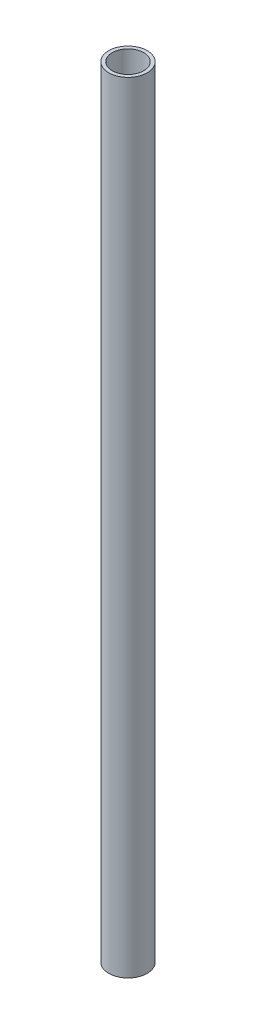
ISO-10303-21;
HEADER;
FILE_DESCRIPTION(('STEP AP214'),'2;1');
FILE_NAME('part.step','',(''),(''),'','','');
FILE_SCHEMA(('AUTOMOTIVE_DESIGN { 1 0 10303 214 1 1 1 1 }'));
ENDSEC;
DATA;
#1=APPLICATION_CONTEXT('core data for automotive mechanical design processes');
#2=APPLICATION_PROTOCOL_DEFINITION('international standard','automotive_design',2000,#1);
#3=PRODUCT_CONTEXT('',#1,'mechanical');
#4=PRODUCT('Part','Part','',(#3));
#5=PRODUCT_RELATED_PRODUCT_CATEGORY('part','',(#4));
#6=PRODUCT_DEFINITION_FORMATION('','',#4);
#7=PRODUCT_DEFINITION_CONTEXT('part definition',#1,'design');
#8=PRODUCT_DEFINITION('design','',#6,#7);
#9=PRODUCT_DEFINITION_SHAPE('','',#8);
#10=(LENGTH_UNIT() NAMED_UNIT(*) SI_UNIT(.MILLI.,.METRE.));
#11=(NAMED_UNIT(*) PLANE_ANGLE_UNIT() SI_UNIT($,.RADIAN.));
#12=(NAMED_UNIT(*) SI_UNIT($,.STERADIAN.) SOLID_ANGLE_UNIT());
#13=UNCERTAINTY_MEASURE_WITH_UNIT(LENGTH_MEASURE(1.E-05),#10,'distance_accuracy_value','');
#14=(GEOMETRIC_REPRESENTATION_CONTEXT(3) GLOBAL_UNCERTAINTY_ASSIGNED_CONTEXT((#13)) GLOBAL_UNIT_ASSIGNED_CONTEXT((#10,
#11,#12)) REPRESENTATION_CONTEXT('',''));
#15=CARTESIAN_POINT('',(0.,0.,0.));
#16=DIRECTION('',(0.,0.,1.));
#17=DIRECTION('',(1.,0.,0.));
#18=AXIS2_PLACEMENT_3D('',#15,#16,#17);
#19=CARTESIAN_POINT('',(0.,855.6625,0.));
#20=DIRECTION('',(0.,1.,0.));
#21=DIRECTION('',(0.,0.,1.));
#22=AXIS2_PLACEMENT_3D('',#19,#20,#21);
#23=PLANE('',#22);
#24=CARTESIAN_POINT('',(0.,855.6625,0.));
#25=DIRECTION('',(0.,1.,0.));
#26=DIRECTION('',(0.,0.,1.));
#27=AXIS2_PLACEMENT_3D('',#24,#25,#26);
#28=CIRCLE('',#27,21.082);
#29=CARTESIAN_POINT('',(0.,855.6625,21.082));
#30=VERTEX_POINT('',#29);
#31=EDGE_CURVE('E10',#30,#30,#28,.T.);
#32=ORIENTED_EDGE('',*,*,#31,.T.);
#33=EDGE_LOOP('',(#32));
#34=FACE_BOUND('',#33,.T.);
#35=CARTESIAN_POINT('',(0.,855.6625,0.));
#36=DIRECTION('',(0.,1.,0.));
#37=DIRECTION('',(0.,0.,1.));
#38=AXIS2_PLACEMENT_3D('',#35,#36,#37);
#39=CIRCLE('',#38,17.272);
#40=CARTESIAN_POINT('',(0.,855.6625,17.272));
#41=VERTEX_POINT('',#40);
#42=EDGE_CURVE('E44',#41,#41,#39,.T.);
#43=ORIENTED_EDGE('',*,*,#42,.F.);
#44=EDGE_LOOP('',(#43));
#45=FACE_BOUND('',#44,.T.);
#46=ADVANCED_FACE('F33',(#34,#45),#23,.T.);
#47=CARTESIAN_POINT('',(0.,0.,0.));
#48=DIRECTION('',(0.,1.,0.));
#49=DIRECTION('',(0.,0.,1.));
#50=AXIS2_PLACEMENT_3D('',#47,#48,#49);
#51=PLANE('',#50);
#52=CARTESIAN_POINT('',(0.,0.,0.));
#53=DIRECTION('',(0.,1.,0.));
#54=DIRECTION('',(0.,0.,1.));
#55=AXIS2_PLACEMENT_3D('',#52,#53,#54);
#56=CIRCLE('',#55,21.082);
#57=CARTESIAN_POINT('',(0.,0.,21.082));
#58=VERTEX_POINT('',#57);
#59=EDGE_CURVE('E37',#58,#58,#56,.T.);
#60=ORIENTED_EDGE('',*,*,#59,.F.);
#61=EDGE_LOOP('',(#60));
#62=FACE_BOUND('',#61,.T.);
#63=CARTESIAN_POINT('',(0.,0.,0.));
#64=DIRECTION('',(0.,1.,0.));
#65=DIRECTION('',(0.,0.,1.));
#66=AXIS2_PLACEMENT_3D('',#63,#64,#65);
#67=CIRCLE('',#66,17.272);
#68=CARTESIAN_POINT('',(0.,0.,17.272));
#69=VERTEX_POINT('',#68);
#70=EDGE_CURVE('E46',#69,#69,#67,.T.);
#71=ORIENTED_EDGE('',*,*,#70,.T.);
#72=EDGE_LOOP('',(#71));
#73=FACE_BOUND('',#72,.T.);
#74=ADVANCED_FACE('F56',(#62,#73),#51,.F.);
#75=CARTESIAN_POINT('',(0.,855.6625,0.));
#76=DIRECTION('',(0.,-1.,0.));
#77=DIRECTION('',(0.,0.,-1.));
#78=AXIS2_PLACEMENT_3D('',#75,#76,#77);
#79=CYLINDRICAL_SURFACE('',#78,21.082);
#80=ORIENTED_EDGE('',*,*,#31,.F.);
#81=EDGE_LOOP('',(#80));
#82=FACE_BOUND('',#81,.T.);
#83=ORIENTED_EDGE('',*,*,#59,.T.);
#84=EDGE_LOOP('',(#83));
#85=FACE_BOUND('',#84,.T.);
#86=ADVANCED_FACE('F35',(#82,#85),#79,.T.);
#87=CARTESIAN_POINT('',(0.,855.6625,0.));
#88=DIRECTION('',(0.,-1.,0.));
#89=DIRECTION('',(0.,0.,-1.));
#90=AXIS2_PLACEMENT_3D('',#87,#88,#89);
#91=CYLINDRICAL_SURFACE('',#90,17.272);
#92=ORIENTED_EDGE('',*,*,#42,.T.);
#93=EDGE_LOOP('',(#92));
#94=FACE_BOUND('',#93,.T.);
#95=ORIENTED_EDGE('',*,*,#70,.F.);
#96=EDGE_LOOP('',(#95));
#97=FACE_BOUND('',#96,.T.);
#98=ADVANCED_FACE('F52',(#94,#97),#91,.F.);
#99=CLOSED_SHELL('',(#46,#74,#86,#98));
#100=MANIFOLD_SOLID_BREP('B2',#99);
#101=ADVANCED_BREP_SHAPE_REPRESENTATION('',(#18,#100),#14);
#102=SHAPE_DEFINITION_REPRESENTATION(#9,#101);
ENDSEC;
END-ISO-10303-21;
